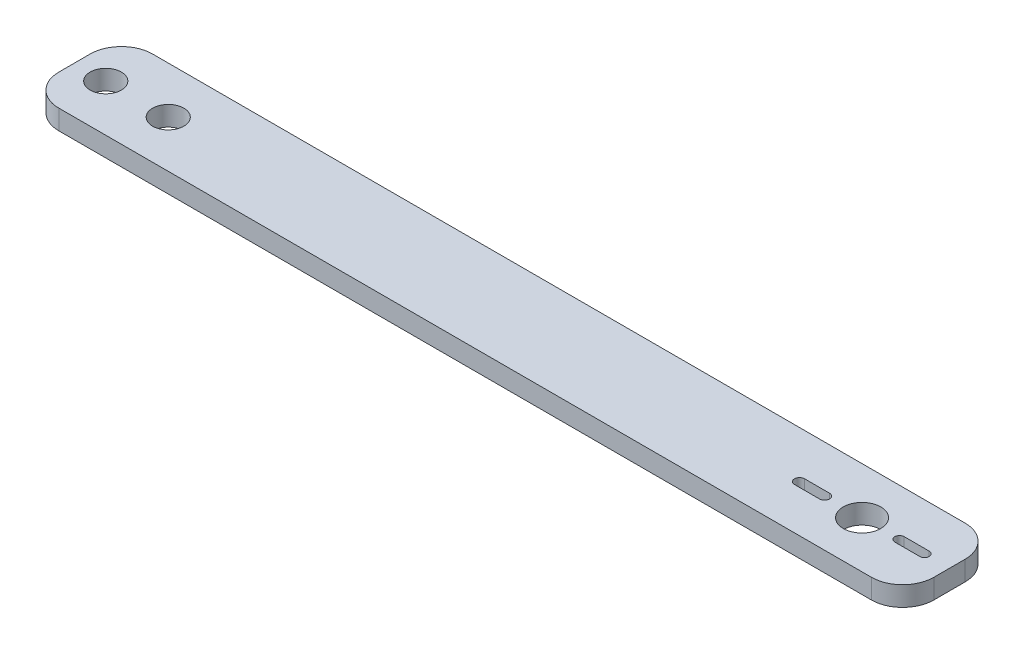
ISO-10303-21;
HEADER;
FILE_DESCRIPTION(('STEP AP214'),'2;1');
FILE_NAME('part.step','',(''),(''),'','','');
FILE_SCHEMA(('AUTOMOTIVE_DESIGN { 1 0 10303 214 1 1 1 1 }'));
ENDSEC;
DATA;
#1=APPLICATION_CONTEXT('core data for automotive mechanical design processes');
#2=APPLICATION_PROTOCOL_DEFINITION('international standard','automotive_design',2000,#1);
#3=PRODUCT_CONTEXT('',#1,'mechanical');
#4=PRODUCT('Part','Part','',(#3));
#5=PRODUCT_RELATED_PRODUCT_CATEGORY('part','',(#4));
#6=PRODUCT_DEFINITION_FORMATION('','',#4);
#7=PRODUCT_DEFINITION_CONTEXT('part definition',#1,'design');
#8=PRODUCT_DEFINITION('design','',#6,#7);
#9=PRODUCT_DEFINITION_SHAPE('','',#8);
#10=(LENGTH_UNIT() NAMED_UNIT(*) SI_UNIT(.MILLI.,.METRE.));
#11=(NAMED_UNIT(*) PLANE_ANGLE_UNIT() SI_UNIT($,.RADIAN.));
#12=(NAMED_UNIT(*) SI_UNIT($,.STERADIAN.) SOLID_ANGLE_UNIT());
#13=UNCERTAINTY_MEASURE_WITH_UNIT(LENGTH_MEASURE(1.E-05),#10,'distance_accuracy_value','');
#14=(GEOMETRIC_REPRESENTATION_CONTEXT(3) GLOBAL_UNCERTAINTY_ASSIGNED_CONTEXT((#13)) GLOBAL_UNIT_ASSIGNED_CONTEXT((#10,
#11,#12)) REPRESENTATION_CONTEXT('',''));
#15=CARTESIAN_POINT('',(0.,0.,0.));
#16=DIRECTION('',(0.,0.,1.));
#17=DIRECTION('',(1.,0.,0.));
#18=AXIS2_PLACEMENT_3D('',#15,#16,#17);
#19=CARTESIAN_POINT('',(-54.3979810745286,4.,-16.9498549690388));
#20=DIRECTION('',(1.,0.,0.));
#21=DIRECTION('',(0.,0.,-1.));
#22=AXIS2_PLACEMENT_3D('',#19,#20,#21);
#23=PLANE('',#22);
#24=DIRECTION('',(0.,0.,1.));
#25=VECTOR('',#24,1.);
#26=CARTESIAN_POINT('',(-54.3979810745286,4.,-16.9498549690388));
#27=LINE('',#26,#25);
#28=CARTESIAN_POINT('',(-54.3979810745286,4.,-10.5998549690389));
#29=VERTEX_POINT('',#28);
#30=CARTESIAN_POINT('',(-54.3979810745286,4.,-4.24985496903885));
#31=VERTEX_POINT('',#30);
#32=EDGE_CURVE('E267',#29,#31,#27,.T.);
#33=ORIENTED_EDGE('',*,*,#32,.F.);
#34=DIRECTION('',(0.,-1.,0.));
#35=VECTOR('',#34,1.);
#36=CARTESIAN_POINT('',(-54.3979810745286,4.,-10.5998549690388));
#37=LINE('',#36,#35);
#38=CARTESIAN_POINT('',(-54.3979810745286,0.,-10.5998549690389));
#39=VERTEX_POINT('',#38);
#40=EDGE_CURVE('E11',#29,#39,#37,.T.);
#41=ORIENTED_EDGE('',*,*,#40,.T.);
#42=DIRECTION('',(0.,0.,1.));
#43=VECTOR('',#42,1.);
#44=CARTESIAN_POINT('',(-54.3979810745286,0.,-16.9498549690388));
#45=LINE('',#44,#43);
#46=CARTESIAN_POINT('',(-54.3979810745286,0.,-4.24985496903885));
#47=VERTEX_POINT('',#46);
#48=EDGE_CURVE('E285',#39,#47,#45,.T.);
#49=ORIENTED_EDGE('',*,*,#48,.T.);
#50=DIRECTION('',(0.,-1.,0.));
#51=VECTOR('',#50,1.);
#52=CARTESIAN_POINT('',(-54.3979810745286,4.,-4.24985496903885));
#53=LINE('',#52,#51);
#54=EDGE_CURVE('E50',#47,#31,#53,.F.);
#55=ORIENTED_EDGE('',*,*,#54,.T.);
#56=EDGE_LOOP('',(#33,#41,#49,#55));
#57=FACE_BOUND('',#56,.T.);
#58=ADVANCED_FACE('F41',(#57),#23,.F.);
#59=CARTESIAN_POINT('',(-54.3979810745286,4.,2.10014503096115));
#60=DIRECTION('',(0.,0.,-1.));
#61=DIRECTION('',(-1.,0.,0.));
#62=AXIS2_PLACEMENT_3D('',#59,#60,#61);
#63=PLANE('',#62);
#64=DIRECTION('',(1.,0.,0.));
#65=VECTOR('',#64,1.);
#66=CARTESIAN_POINT('',(-54.3979810745286,0.,2.10014503096115));
#67=LINE('',#66,#65);
#68=CARTESIAN_POINT('',(-48.0479810745286,0.,2.10014503096115));
#69=VERTEX_POINT('',#68);
#70=CARTESIAN_POINT('',(117.052018925471,0.,2.10014503096115));
#71=VERTEX_POINT('',#70);
#72=EDGE_CURVE('E289',#69,#71,#67,.T.);
#73=ORIENTED_EDGE('',*,*,#72,.T.);
#74=DIRECTION('',(0.,-1.,0.));
#75=VECTOR('',#74,1.);
#76=CARTESIAN_POINT('',(117.052018925471,4.,2.10014503096115));
#77=LINE('',#76,#75);
#78=CARTESIAN_POINT('',(117.052018925471,4.,2.10014503096115));
#79=VERTEX_POINT('',#78);
#80=EDGE_CURVE('E342',#71,#79,#77,.F.);
#81=ORIENTED_EDGE('',*,*,#80,.T.);
#82=DIRECTION('',(1.,0.,0.));
#83=VECTOR('',#82,1.);
#84=CARTESIAN_POINT('',(-54.3979810745286,4.,2.10014503096115));
#85=LINE('',#84,#83);
#86=CARTESIAN_POINT('',(-48.0479810745286,4.,2.10014503096115));
#87=VERTEX_POINT('',#86);
#88=EDGE_CURVE('E271',#87,#79,#85,.T.);
#89=ORIENTED_EDGE('',*,*,#88,.F.);
#90=DIRECTION('',(0.,-1.,0.));
#91=VECTOR('',#90,1.);
#92=CARTESIAN_POINT('',(-48.0479810745286,4.,2.10014503096115));
#93=LINE('',#92,#91);
#94=EDGE_CURVE('E338',#87,#69,#93,.T.);
#95=ORIENTED_EDGE('',*,*,#94,.T.);
#96=EDGE_LOOP('',(#73,#81,#89,#95));
#97=FACE_BOUND('',#96,.T.);
#98=ADVANCED_FACE('F359',(#97),#63,.F.);
#99=CARTESIAN_POINT('',(123.402018925471,4.,-16.9498549690388));
#100=DIRECTION('',(-1.,0.,0.));
#101=DIRECTION('',(0.,0.,1.));
#102=AXIS2_PLACEMENT_3D('',#99,#100,#101);
#103=PLANE('',#102);
#104=DIRECTION('',(0.,0.,-1.));
#105=VECTOR('',#104,1.);
#106=CARTESIAN_POINT('',(123.402018925471,0.,-16.9498549690388));
#107=LINE('',#106,#105);
#108=CARTESIAN_POINT('',(123.402018925471,0.,-4.24985496903885));
#109=VERTEX_POINT('',#108);
#110=CARTESIAN_POINT('',(123.402018925471,0.,-10.5998549690389));
#111=VERTEX_POINT('',#110);
#112=EDGE_CURVE('E294',#109,#111,#107,.T.);
#113=ORIENTED_EDGE('',*,*,#112,.T.);
#114=DIRECTION('',(0.,-1.,0.));
#115=VECTOR('',#114,1.);
#116=CARTESIAN_POINT('',(123.402018925471,4.,-10.5998549690388));
#117=LINE('',#116,#115);
#118=CARTESIAN_POINT('',(123.402018925471,4.,-10.5998549690389));
#119=VERTEX_POINT('',#118);
#120=EDGE_CURVE('E323',#111,#119,#117,.F.);
#121=ORIENTED_EDGE('',*,*,#120,.T.);
#122=DIRECTION('',(0.,0.,-1.));
#123=VECTOR('',#122,1.);
#124=CARTESIAN_POINT('',(123.402018925471,4.,-16.9498549690388));
#125=LINE('',#124,#123);
#126=CARTESIAN_POINT('',(123.402018925471,4.,-4.24985496903885));
#127=VERTEX_POINT('',#126);
#128=EDGE_CURVE('E276',#127,#119,#125,.T.);
#129=ORIENTED_EDGE('',*,*,#128,.F.);
#130=DIRECTION('',(0.,-1.,0.));
#131=VECTOR('',#130,1.);
#132=CARTESIAN_POINT('',(123.402018925471,4.,-4.24985496903885));
#133=LINE('',#132,#131);
#134=EDGE_CURVE('E319',#127,#109,#133,.T.);
#135=ORIENTED_EDGE('',*,*,#134,.T.);
#136=EDGE_LOOP('',(#113,#121,#129,#135));
#137=FACE_BOUND('',#136,.T.);
#138=ADVANCED_FACE('F370',(#137),#103,.F.);
#139=CARTESIAN_POINT('',(-54.3979810745286,4.,-16.9498549690388));
#140=DIRECTION('',(0.,0.,1.));
#141=DIRECTION('',(1.,0.,0.));
#142=AXIS2_PLACEMENT_3D('',#139,#140,#141);
#143=PLANE('',#142);
#144=DIRECTION('',(-1.,0.,0.));
#145=VECTOR('',#144,1.);
#146=CARTESIAN_POINT('',(-54.3979810745286,4.,-16.9498549690388));
#147=LINE('',#146,#145);
#148=CARTESIAN_POINT('',(117.052018925471,4.,-16.9498549690388));
#149=VERTEX_POINT('',#148);
#150=CARTESIAN_POINT('',(-48.0479810745286,4.,-16.9498549690388));
#151=VERTEX_POINT('',#150);
#152=EDGE_CURVE('E280',#149,#151,#147,.T.);
#153=ORIENTED_EDGE('',*,*,#152,.F.);
#154=DIRECTION('',(0.,-1.,0.));
#155=VECTOR('',#154,1.);
#156=CARTESIAN_POINT('',(117.052018925471,4.,-16.9498549690388));
#157=LINE('',#156,#155);
#158=CARTESIAN_POINT('',(117.052018925471,0.,-16.9498549690388));
#159=VERTEX_POINT('',#158);
#160=EDGE_CURVE('E303',#149,#159,#157,.T.);
#161=ORIENTED_EDGE('',*,*,#160,.T.);
#162=DIRECTION('',(-1.,0.,0.));
#163=VECTOR('',#162,1.);
#164=CARTESIAN_POINT('',(-54.3979810745286,0.,-16.9498549690388));
#165=LINE('',#164,#163);
#166=CARTESIAN_POINT('',(-48.0479810745286,0.,-16.9498549690388));
#167=VERTEX_POINT('',#166);
#168=EDGE_CURVE('E272',#159,#167,#165,.T.);
#169=ORIENTED_EDGE('',*,*,#168,.T.);
#170=DIRECTION('',(0.,-1.,0.));
#171=VECTOR('',#170,1.);
#172=CARTESIAN_POINT('',(-48.0479810745286,4.,-16.9498549690388));
#173=LINE('',#172,#171);
#174=EDGE_CURVE('E284',#167,#151,#173,.F.);
#175=ORIENTED_EDGE('',*,*,#174,.T.);
#176=EDGE_LOOP('',(#153,#161,#169,#175));
#177=FACE_BOUND('',#176,.T.);
#178=ADVANCED_FACE('F378',(#177),#143,.F.);
#179=CARTESIAN_POINT('',(0.,4.,0.));
#180=DIRECTION('',(0.,1.,0.));
#181=DIRECTION('',(0.,0.,1.));
#182=AXIS2_PLACEMENT_3D('',#179,#180,#181);
#183=PLANE('',#182);
#184=CARTESIAN_POINT('',(-48.0479810745286,4.,-7.42485496903885));
#185=DIRECTION('',(0.,1.,0.));
#186=DIRECTION('',(0.,0.,1.));
#187=AXIS2_PLACEMENT_3D('',#184,#185,#186);
#188=CIRCLE('',#187,3.175);
#189=CARTESIAN_POINT('',(-48.0479810745286,4.,-4.24985496903885));
#190=VERTEX_POINT('',#189);
#191=EDGE_CURVE('E186',#190,#190,#188,.T.);
#192=ORIENTED_EDGE('',*,*,#191,.F.);
#193=EDGE_LOOP('',(#192));
#194=FACE_BOUND('',#193,.T.);
#195=CARTESIAN_POINT('',(98.0020189254713,4.,-7.42485496903885));
#196=DIRECTION('',(0.,1.,0.));
#197=DIRECTION('',(0.,0.,1.));
#198=AXIS2_PLACEMENT_3D('',#195,#196,#197);
#199=CIRCLE('',#198,1.016);
#200=CARTESIAN_POINT('',(98.0020189254713,4.,-6.40885496903885));
#201=VERTEX_POINT('',#200);
#202=CARTESIAN_POINT('',(98.0020189254713,4.,-8.44085496903885));
#203=VERTEX_POINT('',#202);
#204=EDGE_CURVE('E57',#201,#203,#199,.T.);
#205=ORIENTED_EDGE('',*,*,#204,.F.);
#206=DIRECTION('',(1.,0.,0.));
#207=VECTOR('',#206,1.);
#208=CARTESIAN_POINT('',(98.0020189254713,4.,-6.40885496903885));
#209=LINE('',#208,#207);
#210=CARTESIAN_POINT('',(92.9220189254713,4.,-6.40885496903885));
#211=VERTEX_POINT('',#210);
#212=EDGE_CURVE('E216',#211,#201,#209,.T.);
#213=ORIENTED_EDGE('',*,*,#212,.F.);
#214=CARTESIAN_POINT('',(92.9220189254713,4.,-7.42485496903885));
#215=DIRECTION('',(0.,1.,0.));
#216=DIRECTION('',(0.,0.,1.));
#217=AXIS2_PLACEMENT_3D('',#214,#215,#216);
#218=CIRCLE('',#217,1.016);
#219=CARTESIAN_POINT('',(92.9220189254713,4.,-8.44085496903885));
#220=VERTEX_POINT('',#219);
#221=EDGE_CURVE('E235',#220,#211,#218,.T.);
#222=ORIENTED_EDGE('',*,*,#221,.F.);
#223=DIRECTION('',(-1.,0.,0.));
#224=VECTOR('',#223,1.);
#225=CARTESIAN_POINT('',(98.0020189254713,4.,-8.44085496903885));
#226=LINE('',#225,#224);
#227=EDGE_CURVE('E231',#203,#220,#226,.T.);
#228=ORIENTED_EDGE('',*,*,#227,.F.);
#229=EDGE_LOOP('',(#205,#213,#222,#228));
#230=FACE_BOUND('',#229,.T.);
#231=CARTESIAN_POINT('',(113.242018925471,4.,-7.42485496903885));
#232=DIRECTION('',(0.,1.,0.));
#233=DIRECTION('',(0.,0.,1.));
#234=AXIS2_PLACEMENT_3D('',#231,#232,#233);
#235=CIRCLE('',#234,0.9525);
#236=CARTESIAN_POINT('',(113.242018925471,4.,-8.37735496903885));
#237=VERTEX_POINT('',#236);
#238=CARTESIAN_POINT('',(113.242018925471,4.,-6.47235496903885));
#239=VERTEX_POINT('',#238);
#240=EDGE_CURVE('E65',#237,#239,#235,.T.);
#241=ORIENTED_EDGE('',*,*,#240,.F.);
#242=DIRECTION('',(-1.,0.,0.));
#243=VECTOR('',#242,1.);
#244=CARTESIAN_POINT('',(113.242018925471,4.,-8.37735496903885));
#245=LINE('',#244,#243);
#246=CARTESIAN_POINT('',(118.322018925471,4.,-8.37735496903885));
#247=VERTEX_POINT('',#246);
#248=EDGE_CURVE('E179',#247,#237,#245,.T.);
#249=ORIENTED_EDGE('',*,*,#248,.F.);
#250=CARTESIAN_POINT('',(118.322018925471,4.,-7.42485496903885));
#251=DIRECTION('',(0.,1.,0.));
#252=DIRECTION('',(0.,0.,1.));
#253=AXIS2_PLACEMENT_3D('',#250,#251,#252);
#254=CIRCLE('',#253,0.952499999999998);
#255=CARTESIAN_POINT('',(118.322018925471,4.,-6.47235496903885));
#256=VERTEX_POINT('',#255);
#257=EDGE_CURVE('E183',#256,#247,#254,.T.);
#258=ORIENTED_EDGE('',*,*,#257,.F.);
#259=DIRECTION('',(1.,0.,0.));
#260=VECTOR('',#259,1.);
#261=CARTESIAN_POINT('',(113.242018925471,4.,-6.47235496903885));
#262=LINE('',#261,#260);
#263=EDGE_CURVE('E195',#239,#256,#262,.T.);
#264=ORIENTED_EDGE('',*,*,#263,.F.);
#265=EDGE_LOOP('',(#241,#249,#258,#264));
#266=FACE_BOUND('',#265,.T.);
#267=CARTESIAN_POINT('',(105.622018925471,4.,-7.42485496903885));
#268=DIRECTION('',(0.,1.,0.));
#269=DIRECTION('',(0.,0.,1.));
#270=AXIS2_PLACEMENT_3D('',#267,#268,#269);
#271=CIRCLE('',#270,3.81);
#272=CARTESIAN_POINT('',(105.622018925471,4.,-3.61485496903885));
#273=VERTEX_POINT('',#272);
#274=EDGE_CURVE('E205',#273,#273,#271,.T.);
#275=ORIENTED_EDGE('',*,*,#274,.F.);
#276=EDGE_LOOP('',(#275));
#277=FACE_BOUND('',#276,.T.);
#278=CARTESIAN_POINT('',(-35.3479810745286,4.,-7.42485496903885));
#279=DIRECTION('',(0.,1.,0.));
#280=DIRECTION('',(0.,0.,1.));
#281=AXIS2_PLACEMENT_3D('',#278,#279,#280);
#282=CIRCLE('',#281,3.175);
#283=CARTESIAN_POINT('',(-35.3479810745286,4.,-4.24985496903885));
#284=VERTEX_POINT('',#283);
#285=EDGE_CURVE('E256',#284,#284,#282,.T.);
#286=ORIENTED_EDGE('',*,*,#285,.F.);
#287=EDGE_LOOP('',(#286));
#288=FACE_BOUND('',#287,.T.);
#289=ORIENTED_EDGE('',*,*,#128,.T.);
#290=CARTESIAN_POINT('',(117.052018925471,4.,-10.5998549690388));
#291=DIRECTION('',(0.,1.,0.));
#292=DIRECTION('',(0.,0.,1.));
#293=AXIS2_PLACEMENT_3D('',#290,#291,#292);
#294=CIRCLE('',#293,6.35);
#295=EDGE_CURVE('E335',#119,#149,#294,.T.);
#296=ORIENTED_EDGE('',*,*,#295,.T.);
#297=ORIENTED_EDGE('',*,*,#152,.T.);
#298=CARTESIAN_POINT('',(-48.0479810745286,4.,-10.5998549690388));
#299=DIRECTION('',(0.,1.,0.));
#300=DIRECTION('',(0.,0.,1.));
#301=AXIS2_PLACEMENT_3D('',#298,#299,#300);
#302=CIRCLE('',#301,6.35);
#303=EDGE_CURVE('E329',#151,#29,#302,.T.);
#304=ORIENTED_EDGE('',*,*,#303,.T.);
#305=ORIENTED_EDGE('',*,*,#32,.T.);
#306=CARTESIAN_POINT('',(-48.0479810745286,4.,-4.24985496903885));
#307=DIRECTION('',(0.,1.,0.));
#308=DIRECTION('',(0.,0.,1.));
#309=AXIS2_PLACEMENT_3D('',#306,#307,#308);
#310=CIRCLE('',#309,6.35);
#311=EDGE_CURVE('E326',#31,#87,#310,.T.);
#312=ORIENTED_EDGE('',*,*,#311,.T.);
#313=ORIENTED_EDGE('',*,*,#88,.T.);
#314=CARTESIAN_POINT('',(117.052018925471,4.,-4.24985496903885));
#315=DIRECTION('',(0.,1.,0.));
#316=DIRECTION('',(0.,0.,1.));
#317=AXIS2_PLACEMENT_3D('',#314,#315,#316);
#318=CIRCLE('',#317,6.35);
#319=EDGE_CURVE('E332',#79,#127,#318,.T.);
#320=ORIENTED_EDGE('',*,*,#319,.T.);
#321=EDGE_LOOP('',(#289,#296,#297,#304,#305,#312,#313,#320));
#322=FACE_BOUND('',#321,.T.);
#323=ADVANCED_FACE('F353',(#194,#230,#266,#277,#288,#322),#183,.T.);
#324=CARTESIAN_POINT('',(0.,0.,0.));
#325=DIRECTION('',(0.,1.,0.));
#326=DIRECTION('',(0.,0.,1.));
#327=AXIS2_PLACEMENT_3D('',#324,#325,#326);
#328=PLANE('',#327);
#329=CARTESIAN_POINT('',(-48.0479810745286,0.,-7.42485496903885));
#330=DIRECTION('',(0.,1.,0.));
#331=DIRECTION('',(0.,0.,1.));
#332=AXIS2_PLACEMENT_3D('',#329,#330,#331);
#333=CIRCLE('',#332,3.175);
#334=CARTESIAN_POINT('',(-48.0479810745286,0.,-4.24985496903885));
#335=VERTEX_POINT('',#334);
#336=EDGE_CURVE('E290',#335,#335,#333,.T.);
#337=ORIENTED_EDGE('',*,*,#336,.T.);
#338=EDGE_LOOP('',(#337));
#339=FACE_BOUND('',#338,.T.);
#340=DIRECTION('',(1.,0.,0.));
#341=VECTOR('',#340,1.);
#342=CARTESIAN_POINT('',(98.0020189254713,0.,-6.40885496903885));
#343=LINE('',#342,#341);
#344=CARTESIAN_POINT('',(92.9220189254713,0.,-6.40885496903885));
#345=VERTEX_POINT('',#344);
#346=CARTESIAN_POINT('',(98.0020189254713,0.,-6.40885496903885));
#347=VERTEX_POINT('',#346);
#348=EDGE_CURVE('E224',#345,#347,#343,.T.);
#349=ORIENTED_EDGE('',*,*,#348,.T.);
#350=CARTESIAN_POINT('',(98.0020189254713,0.,-7.42485496903885));
#351=DIRECTION('',(0.,1.,0.));
#352=DIRECTION('',(0.,0.,1.));
#353=AXIS2_PLACEMENT_3D('',#350,#351,#352);
#354=CIRCLE('',#353,1.016);
#355=CARTESIAN_POINT('',(98.0020189254713,0.,-8.44085496903885));
#356=VERTEX_POINT('',#355);
#357=EDGE_CURVE('E211',#347,#356,#354,.T.);
#358=ORIENTED_EDGE('',*,*,#357,.T.);
#359=DIRECTION('',(-1.,0.,0.));
#360=VECTOR('',#359,1.);
#361=CARTESIAN_POINT('',(98.0020189254713,0.,-8.44085496903885));
#362=LINE('',#361,#360);
#363=CARTESIAN_POINT('',(92.9220189254713,0.,-8.44085496903885));
#364=VERTEX_POINT('',#363);
#365=EDGE_CURVE('E215',#356,#364,#362,.T.);
#366=ORIENTED_EDGE('',*,*,#365,.T.);
#367=CARTESIAN_POINT('',(92.9220189254713,0.,-7.42485496903885));
#368=DIRECTION('',(0.,1.,0.));
#369=DIRECTION('',(0.,0.,1.));
#370=AXIS2_PLACEMENT_3D('',#367,#368,#369);
#371=CIRCLE('',#370,1.016);
#372=EDGE_CURVE('E220',#364,#345,#371,.T.);
#373=ORIENTED_EDGE('',*,*,#372,.T.);
#374=EDGE_LOOP('',(#349,#358,#366,#373));
#375=FACE_BOUND('',#374,.T.);
#376=DIRECTION('',(-1.,0.,0.));
#377=VECTOR('',#376,1.);
#378=CARTESIAN_POINT('',(113.242018925471,0.,-8.37735496903885));
#379=LINE('',#378,#377);
#380=CARTESIAN_POINT('',(118.322018925471,0.,-8.37735496903885));
#381=VERTEX_POINT('',#380);
#382=CARTESIAN_POINT('',(113.242018925471,0.,-8.37735496903885));
#383=VERTEX_POINT('',#382);
#384=EDGE_CURVE('E164',#381,#383,#379,.T.);
#385=ORIENTED_EDGE('',*,*,#384,.T.);
#386=CARTESIAN_POINT('',(113.242018925471,0.,-7.42485496903885));
#387=DIRECTION('',(0.,1.,0.));
#388=DIRECTION('',(0.,0.,1.));
#389=AXIS2_PLACEMENT_3D('',#386,#387,#388);
#390=CIRCLE('',#389,0.9525);
#391=CARTESIAN_POINT('',(113.242018925471,0.,-6.47235496903885));
#392=VERTEX_POINT('',#391);
#393=EDGE_CURVE('E157',#383,#392,#390,.T.);
#394=ORIENTED_EDGE('',*,*,#393,.T.);
#395=DIRECTION('',(1.,0.,0.));
#396=VECTOR('',#395,1.);
#397=CARTESIAN_POINT('',(113.242018925471,0.,-6.47235496903885));
#398=LINE('',#397,#396);
#399=CARTESIAN_POINT('',(118.322018925471,0.,-6.47235496903885));
#400=VERTEX_POINT('',#399);
#401=EDGE_CURVE('E168',#392,#400,#398,.T.);
#402=ORIENTED_EDGE('',*,*,#401,.T.);
#403=CARTESIAN_POINT('',(118.322018925471,0.,-7.42485496903885));
#404=DIRECTION('',(0.,1.,0.));
#405=DIRECTION('',(0.,0.,1.));
#406=AXIS2_PLACEMENT_3D('',#403,#404,#405);
#407=CIRCLE('',#406,0.952499999999998);
#408=EDGE_CURVE('E173',#400,#381,#407,.T.);
#409=ORIENTED_EDGE('',*,*,#408,.T.);
#410=EDGE_LOOP('',(#385,#394,#402,#409));
#411=FACE_BOUND('',#410,.T.);
#412=CARTESIAN_POINT('',(105.622018925471,0.,-7.42485496903885));
#413=DIRECTION('',(0.,1.,0.));
#414=DIRECTION('',(0.,0.,1.));
#415=AXIS2_PLACEMENT_3D('',#412,#413,#414);
#416=CIRCLE('',#415,3.81);
#417=CARTESIAN_POINT('',(105.622018925471,0.,-3.61485496903885));
#418=VERTEX_POINT('',#417);
#419=EDGE_CURVE('E260',#418,#418,#416,.T.);
#420=ORIENTED_EDGE('',*,*,#419,.T.);
#421=EDGE_LOOP('',(#420));
#422=FACE_BOUND('',#421,.T.);
#423=CARTESIAN_POINT('',(-35.3479810745286,0.,-7.42485496903885));
#424=DIRECTION('',(0.,1.,0.));
#425=DIRECTION('',(0.,0.,1.));
#426=AXIS2_PLACEMENT_3D('',#423,#424,#425);
#427=CIRCLE('',#426,3.175);
#428=CARTESIAN_POINT('',(-35.3479810745286,0.,-4.24985496903885));
#429=VERTEX_POINT('',#428);
#430=EDGE_CURVE('E252',#429,#429,#427,.T.);
#431=ORIENTED_EDGE('',*,*,#430,.T.);
#432=EDGE_LOOP('',(#431));
#433=FACE_BOUND('',#432,.T.);
#434=ORIENTED_EDGE('',*,*,#168,.F.);
#435=CARTESIAN_POINT('',(117.052018925471,0.,-10.5998549690388));
#436=DIRECTION('',(0.,1.,0.));
#437=DIRECTION('',(0.,0.,1.));
#438=AXIS2_PLACEMENT_3D('',#435,#436,#437);
#439=CIRCLE('',#438,6.35);
#440=EDGE_CURVE('E316',#159,#111,#439,.F.);
#441=ORIENTED_EDGE('',*,*,#440,.T.);
#442=ORIENTED_EDGE('',*,*,#112,.F.);
#443=CARTESIAN_POINT('',(117.052018925471,0.,-4.24985496903885));
#444=DIRECTION('',(0.,1.,0.));
#445=DIRECTION('',(0.,0.,1.));
#446=AXIS2_PLACEMENT_3D('',#443,#444,#445);
#447=CIRCLE('',#446,6.35);
#448=EDGE_CURVE('E313',#109,#71,#447,.F.);
#449=ORIENTED_EDGE('',*,*,#448,.T.);
#450=ORIENTED_EDGE('',*,*,#72,.F.);
#451=CARTESIAN_POINT('',(-48.0479810745286,0.,-4.24985496903885));
#452=DIRECTION('',(0.,1.,0.));
#453=DIRECTION('',(0.,0.,1.));
#454=AXIS2_PLACEMENT_3D('',#451,#452,#453);
#455=CIRCLE('',#454,6.35);
#456=EDGE_CURVE('E307',#69,#47,#455,.F.);
#457=ORIENTED_EDGE('',*,*,#456,.T.);
#458=ORIENTED_EDGE('',*,*,#48,.F.);
#459=CARTESIAN_POINT('',(-48.0479810745286,0.,-10.5998549690388));
#460=DIRECTION('',(0.,1.,0.));
#461=DIRECTION('',(0.,0.,1.));
#462=AXIS2_PLACEMENT_3D('',#459,#460,#461);
#463=CIRCLE('',#462,6.35);
#464=EDGE_CURVE('E310',#39,#167,#463,.F.);
#465=ORIENTED_EDGE('',*,*,#464,.T.);
#466=EDGE_LOOP('',(#434,#441,#442,#449,#450,#457,#458,#465));
#467=FACE_BOUND('',#466,.T.);
#468=ADVANCED_FACE('F175',(#339,#375,#411,#422,#433,#467),#328,.F.);
#469=CARTESIAN_POINT('',(117.052018925471,4.,-10.5998549690388));
#470=DIRECTION('',(0.,-1.,0.));
#471=DIRECTION('',(0.,0.,-1.));
#472=AXIS2_PLACEMENT_3D('',#469,#470,#471);
#473=CYLINDRICAL_SURFACE('',#472,6.35);
#474=ORIENTED_EDGE('',*,*,#295,.F.);
#475=ORIENTED_EDGE('',*,*,#120,.F.);
#476=ORIENTED_EDGE('',*,*,#440,.F.);
#477=ORIENTED_EDGE('',*,*,#160,.F.);
#478=EDGE_LOOP('',(#474,#475,#476,#477));
#479=FACE_BOUND('',#478,.T.);
#480=ADVANCED_FACE('F376',(#479),#473,.T.);
#481=CARTESIAN_POINT('',(117.052018925471,4.,-4.24985496903885));
#482=DIRECTION('',(0.,-1.,0.));
#483=DIRECTION('',(0.,0.,-1.));
#484=AXIS2_PLACEMENT_3D('',#481,#482,#483);
#485=CYLINDRICAL_SURFACE('',#484,6.35);
#486=ORIENTED_EDGE('',*,*,#319,.F.);
#487=ORIENTED_EDGE('',*,*,#80,.F.);
#488=ORIENTED_EDGE('',*,*,#448,.F.);
#489=ORIENTED_EDGE('',*,*,#134,.F.);
#490=EDGE_LOOP('',(#486,#487,#488,#489));
#491=FACE_BOUND('',#490,.T.);
#492=ADVANCED_FACE('F367',(#491),#485,.T.);
#493=CARTESIAN_POINT('',(-48.0479810745286,4.,-10.5998549690388));
#494=DIRECTION('',(0.,-1.,0.));
#495=DIRECTION('',(0.,0.,-1.));
#496=AXIS2_PLACEMENT_3D('',#493,#494,#495);
#497=CYLINDRICAL_SURFACE('',#496,6.35);
#498=ORIENTED_EDGE('',*,*,#303,.F.);
#499=ORIENTED_EDGE('',*,*,#174,.F.);
#500=ORIENTED_EDGE('',*,*,#464,.F.);
#501=ORIENTED_EDGE('',*,*,#40,.F.);
#502=EDGE_LOOP('',(#498,#499,#500,#501));
#503=FACE_BOUND('',#502,.T.);
#504=ADVANCED_FACE('F381',(#503),#497,.T.);
#505=CARTESIAN_POINT('',(-48.0479810745286,4.,-4.24985496903885));
#506=DIRECTION('',(0.,-1.,0.));
#507=DIRECTION('',(0.,0.,-1.));
#508=AXIS2_PLACEMENT_3D('',#505,#506,#507);
#509=CYLINDRICAL_SURFACE('',#508,6.35);
#510=ORIENTED_EDGE('',*,*,#311,.F.);
#511=ORIENTED_EDGE('',*,*,#54,.F.);
#512=ORIENTED_EDGE('',*,*,#456,.F.);
#513=ORIENTED_EDGE('',*,*,#94,.F.);
#514=EDGE_LOOP('',(#510,#511,#512,#513));
#515=FACE_BOUND('',#514,.T.);
#516=ADVANCED_FACE('F43',(#515),#509,.T.);
#517=CARTESIAN_POINT('',(-35.3479810745286,0.,-7.42485496903885));
#518=DIRECTION('',(0.,1.,0.));
#519=DIRECTION('',(0.,0.,1.));
#520=AXIS2_PLACEMENT_3D('',#517,#518,#519);
#521=CYLINDRICAL_SURFACE('',#520,3.175);
#522=ORIENTED_EDGE('',*,*,#430,.F.);
#523=EDGE_LOOP('',(#522));
#524=FACE_BOUND('',#523,.T.);
#525=ORIENTED_EDGE('',*,*,#285,.T.);
#526=EDGE_LOOP('',(#525));
#527=FACE_BOUND('',#526,.T.);
#528=ADVANCED_FACE('F387',(#524,#527),#521,.F.);
#529=CARTESIAN_POINT('',(105.622018925471,0.,-7.42485496903885));
#530=DIRECTION('',(0.,1.,0.));
#531=DIRECTION('',(0.,0.,1.));
#532=AXIS2_PLACEMENT_3D('',#529,#530,#531);
#533=CYLINDRICAL_SURFACE('',#532,3.81);
#534=ORIENTED_EDGE('',*,*,#419,.F.);
#535=EDGE_LOOP('',(#534));
#536=FACE_BOUND('',#535,.T.);
#537=ORIENTED_EDGE('',*,*,#274,.T.);
#538=EDGE_LOOP('',(#537));
#539=FACE_BOUND('',#538,.T.);
#540=ADVANCED_FACE('F443',(#536,#539),#533,.F.);
#541=CARTESIAN_POINT('',(113.242018925471,0.,-7.42485496903885));
#542=DIRECTION('',(0.,1.,0.));
#543=DIRECTION('',(0.,0.,1.));
#544=AXIS2_PLACEMENT_3D('',#541,#542,#543);
#545=CYLINDRICAL_SURFACE('',#544,0.9525);
#546=ORIENTED_EDGE('',*,*,#240,.T.);
#547=DIRECTION('',(0.,1.,0.));
#548=VECTOR('',#547,1.);
#549=CARTESIAN_POINT('',(113.242018925471,0.,-6.47235496903885));
#550=LINE('',#549,#548);
#551=EDGE_CURVE('E153',#392,#239,#550,.T.);
#552=ORIENTED_EDGE('',*,*,#551,.F.);
#553=ORIENTED_EDGE('',*,*,#393,.F.);
#554=DIRECTION('',(0.,1.,0.));
#555=VECTOR('',#554,1.);
#556=CARTESIAN_POINT('',(113.242018925471,0.,-8.37735496903885));
#557=LINE('',#556,#555);
#558=EDGE_CURVE('E202',#383,#237,#557,.T.);
#559=ORIENTED_EDGE('',*,*,#558,.T.);
#560=EDGE_LOOP('',(#546,#552,#553,#559));
#561=FACE_BOUND('',#560,.T.);
#562=ADVANCED_FACE('F155',(#561),#545,.F.);
#563=CARTESIAN_POINT('',(113.242018925471,0.,-8.37735496903885));
#564=DIRECTION('',(0.,0.,-1.));
#565=DIRECTION('',(-1.,0.,0.));
#566=AXIS2_PLACEMENT_3D('',#563,#564,#565);
#567=PLANE('',#566);
#568=ORIENTED_EDGE('',*,*,#248,.T.);
#569=ORIENTED_EDGE('',*,*,#558,.F.);
#570=ORIENTED_EDGE('',*,*,#384,.F.);
#571=DIRECTION('',(0.,1.,0.));
#572=VECTOR('',#571,1.);
#573=CARTESIAN_POINT('',(118.322018925471,0.,-8.37735496903885));
#574=LINE('',#573,#572);
#575=EDGE_CURVE('E206',#381,#247,#574,.T.);
#576=ORIENTED_EDGE('',*,*,#575,.T.);
#577=EDGE_LOOP('',(#568,#569,#570,#576));
#578=FACE_BOUND('',#577,.T.);
#579=ADVANCED_FACE('F461',(#578),#567,.F.);
#580=CARTESIAN_POINT('',(118.322018925471,0.,-7.42485496903885));
#581=DIRECTION('',(0.,1.,0.));
#582=DIRECTION('',(0.,0.,1.));
#583=AXIS2_PLACEMENT_3D('',#580,#581,#582);
#584=CYLINDRICAL_SURFACE('',#583,0.952499999999998);
#585=ORIENTED_EDGE('',*,*,#257,.T.);
#586=ORIENTED_EDGE('',*,*,#575,.F.);
#587=ORIENTED_EDGE('',*,*,#408,.F.);
#588=DIRECTION('',(0.,1.,0.));
#589=VECTOR('',#588,1.);
#590=CARTESIAN_POINT('',(118.322018925471,0.,-6.47235496903885));
#591=LINE('',#590,#589);
#592=EDGE_CURVE('E163',#400,#256,#591,.T.);
#593=ORIENTED_EDGE('',*,*,#592,.T.);
#594=EDGE_LOOP('',(#585,#586,#587,#593));
#595=FACE_BOUND('',#594,.T.);
#596=ADVANCED_FACE('F470',(#595),#584,.F.);
#597=CARTESIAN_POINT('',(113.242018925471,0.,-6.47235496903885));
#598=DIRECTION('',(0.,0.,1.));
#599=DIRECTION('',(1.,0.,0.));
#600=AXIS2_PLACEMENT_3D('',#597,#598,#599);
#601=PLANE('',#600);
#602=ORIENTED_EDGE('',*,*,#263,.T.);
#603=ORIENTED_EDGE('',*,*,#592,.F.);
#604=ORIENTED_EDGE('',*,*,#401,.F.);
#605=ORIENTED_EDGE('',*,*,#551,.T.);
#606=EDGE_LOOP('',(#602,#603,#604,#605));
#607=FACE_BOUND('',#606,.T.);
#608=ADVANCED_FACE('F169',(#607),#601,.F.);
#609=CARTESIAN_POINT('',(98.0020189254713,0.,-7.42485496903885));
#610=DIRECTION('',(0.,1.,0.));
#611=DIRECTION('',(0.,0.,1.));
#612=AXIS2_PLACEMENT_3D('',#609,#610,#611);
#613=CYLINDRICAL_SURFACE('',#612,1.016);
#614=ORIENTED_EDGE('',*,*,#204,.T.);
#615=DIRECTION('',(0.,1.,0.));
#616=VECTOR('',#615,1.);
#617=CARTESIAN_POINT('',(98.0020189254713,0.,-8.44085496903885));
#618=LINE('',#617,#616);
#619=EDGE_CURVE('E228',#356,#203,#618,.T.);
#620=ORIENTED_EDGE('',*,*,#619,.F.);
#621=ORIENTED_EDGE('',*,*,#357,.F.);
#622=DIRECTION('',(0.,1.,0.));
#623=VECTOR('',#622,1.);
#624=CARTESIAN_POINT('',(98.0020189254713,0.,-6.40885496903885));
#625=LINE('',#624,#623);
#626=EDGE_CURVE('E196',#347,#201,#625,.T.);
#627=ORIENTED_EDGE('',*,*,#626,.T.);
#628=EDGE_LOOP('',(#614,#620,#621,#627));
#629=FACE_BOUND('',#628,.T.);
#630=ADVANCED_FACE('F489',(#629),#613,.F.);
#631=CARTESIAN_POINT('',(98.0020189254713,0.,-6.40885496903885));
#632=DIRECTION('',(0.,0.,1.));
#633=DIRECTION('',(1.,0.,0.));
#634=AXIS2_PLACEMENT_3D('',#631,#632,#633);
#635=PLANE('',#634);
#636=ORIENTED_EDGE('',*,*,#212,.T.);
#637=ORIENTED_EDGE('',*,*,#626,.F.);
#638=ORIENTED_EDGE('',*,*,#348,.F.);
#639=DIRECTION('',(0.,1.,0.));
#640=VECTOR('',#639,1.);
#641=CARTESIAN_POINT('',(92.9220189254713,0.,-6.40885496903885));
#642=LINE('',#641,#640);
#643=EDGE_CURVE('E244',#345,#211,#642,.T.);
#644=ORIENTED_EDGE('',*,*,#643,.T.);
#645=EDGE_LOOP('',(#636,#637,#638,#644));
#646=FACE_BOUND('',#645,.T.);
#647=ADVANCED_FACE('F498',(#646),#635,.F.);
#648=CARTESIAN_POINT('',(92.9220189254713,0.,-7.42485496903885));
#649=DIRECTION('',(0.,1.,0.));
#650=DIRECTION('',(0.,0.,1.));
#651=AXIS2_PLACEMENT_3D('',#648,#649,#650);
#652=CYLINDRICAL_SURFACE('',#651,1.016);
#653=ORIENTED_EDGE('',*,*,#221,.T.);
#654=ORIENTED_EDGE('',*,*,#643,.F.);
#655=ORIENTED_EDGE('',*,*,#372,.F.);
#656=DIRECTION('',(0.,1.,0.));
#657=VECTOR('',#656,1.);
#658=CARTESIAN_POINT('',(92.9220189254713,0.,-8.44085496903885));
#659=LINE('',#658,#657);
#660=EDGE_CURVE('E247',#364,#220,#659,.T.);
#661=ORIENTED_EDGE('',*,*,#660,.T.);
#662=EDGE_LOOP('',(#653,#654,#655,#661));
#663=FACE_BOUND('',#662,.T.);
#664=ADVANCED_FACE('F507',(#663),#652,.F.);
#665=CARTESIAN_POINT('',(98.0020189254713,0.,-8.44085496903885));
#666=DIRECTION('',(0.,0.,-1.));
#667=DIRECTION('',(-1.,0.,0.));
#668=AXIS2_PLACEMENT_3D('',#665,#666,#667);
#669=PLANE('',#668);
#670=ORIENTED_EDGE('',*,*,#227,.T.);
#671=ORIENTED_EDGE('',*,*,#660,.F.);
#672=ORIENTED_EDGE('',*,*,#365,.F.);
#673=ORIENTED_EDGE('',*,*,#619,.T.);
#674=EDGE_LOOP('',(#670,#671,#672,#673));
#675=FACE_BOUND('',#674,.T.);
#676=ADVANCED_FACE('F517',(#675),#669,.F.);
#677=CARTESIAN_POINT('',(-48.0479810745286,0.,-7.42485496903885));
#678=DIRECTION('',(0.,1.,0.));
#679=DIRECTION('',(0.,0.,1.));
#680=AXIS2_PLACEMENT_3D('',#677,#678,#679);
#681=CYLINDRICAL_SURFACE('',#680,3.175);
#682=ORIENTED_EDGE('',*,*,#336,.F.);
#683=EDGE_LOOP('',(#682));
#684=FACE_BOUND('',#683,.T.);
#685=ORIENTED_EDGE('',*,*,#191,.T.);
#686=EDGE_LOOP('',(#685));
#687=FACE_BOUND('',#686,.T.);
#688=ADVANCED_FACE('F527',(#684,#687),#681,.F.);
#689=CLOSED_SHELL('',(#58,#98,#138,#178,#323,#468,#480,#492,#504,#516,#528,#540,#562,#579,#596,
#608,#630,#647,#664,#676,#688));
#690=MANIFOLD_SOLID_BREP('B2',#689);
#691=ADVANCED_BREP_SHAPE_REPRESENTATION('',(#18,#690),#14);
#692=SHAPE_DEFINITION_REPRESENTATION(#9,#691);
ENDSEC;
END-ISO-10303-21;
